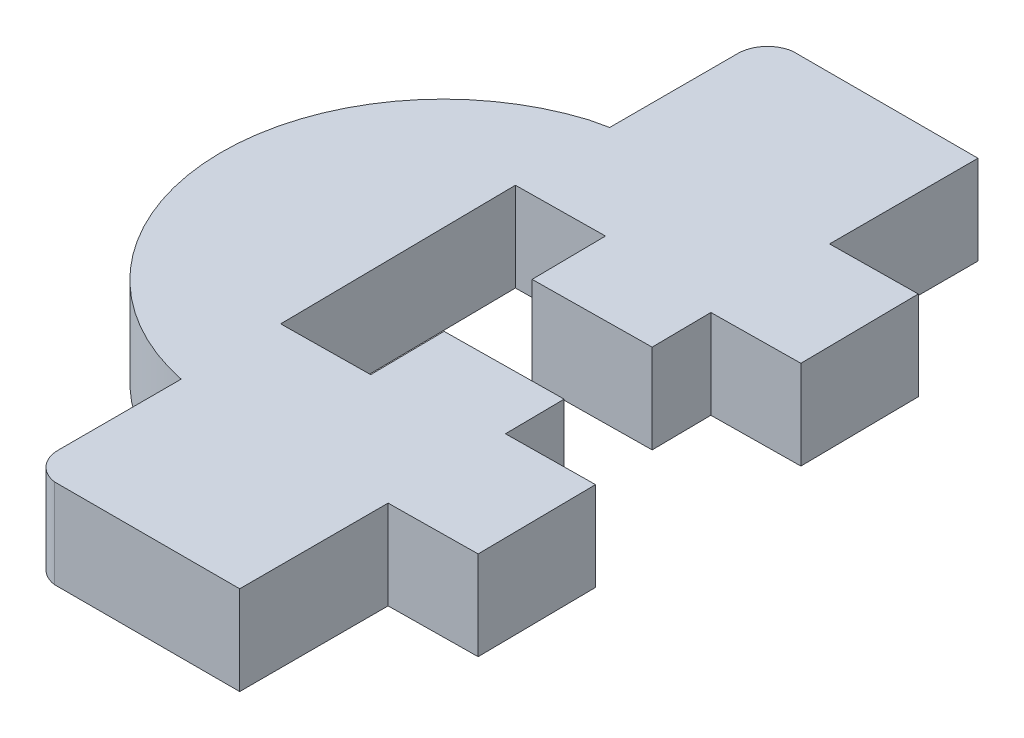
ISO-10303-21;
HEADER;
FILE_DESCRIPTION(('STEP AP214'),'2;1');
FILE_NAME('part.step','',(''),(''),'','','');
FILE_SCHEMA(('AUTOMOTIVE_DESIGN { 1 0 10303 214 1 1 1 1 }'));
ENDSEC;
DATA;
#1=APPLICATION_CONTEXT('core data for automotive mechanical design processes');
#2=APPLICATION_PROTOCOL_DEFINITION('international standard','automotive_design',2000,#1);
#3=PRODUCT_CONTEXT('',#1,'mechanical');
#4=PRODUCT('Part','Part','',(#3));
#5=PRODUCT_RELATED_PRODUCT_CATEGORY('part','',(#4));
#6=PRODUCT_DEFINITION_FORMATION('','',#4);
#7=PRODUCT_DEFINITION_CONTEXT('part definition',#1,'design');
#8=PRODUCT_DEFINITION('design','',#6,#7);
#9=PRODUCT_DEFINITION_SHAPE('','',#8);
#10=(LENGTH_UNIT() NAMED_UNIT(*) SI_UNIT(.MILLI.,.METRE.));
#11=(NAMED_UNIT(*) PLANE_ANGLE_UNIT() SI_UNIT($,.RADIAN.));
#12=(NAMED_UNIT(*) SI_UNIT($,.STERADIAN.) SOLID_ANGLE_UNIT());
#13=UNCERTAINTY_MEASURE_WITH_UNIT(LENGTH_MEASURE(1.E-05),#10,'distance_accuracy_value','');
#14=(GEOMETRIC_REPRESENTATION_CONTEXT(3) GLOBAL_UNCERTAINTY_ASSIGNED_CONTEXT((#13)) GLOBAL_UNIT_ASSIGNED_CONTEXT((#10,
#11,#12)) REPRESENTATION_CONTEXT('',''));
#15=CARTESIAN_POINT('',(0.,0.,0.));
#16=DIRECTION('',(0.,0.,1.));
#17=DIRECTION('',(1.,0.,0.));
#18=AXIS2_PLACEMENT_3D('',#15,#16,#17);
#19=CARTESIAN_POINT('',(33646.1273203237,3.,0.));
#20=DIRECTION('',(1.,0.,0.));
#21=DIRECTION('',(0.,0.,-1.));
#22=AXIS2_PLACEMENT_3D('',#19,#20,#21);
#23=PLANE('',#22);
#24=DIRECTION('',(0.,0.,1.));
#25=VECTOR('',#24,1.);
#26=CARTESIAN_POINT('',(33646.1273203237,0.,0.));
#27=LINE('',#26,#25);
#28=CARTESIAN_POINT('',(33646.1273202987,0.,-12660.1108290611));
#29=VERTEX_POINT('',#28);
#30=CARTESIAN_POINT('',(33646.1273203237,0.,-12655.1108268603));
#31=VERTEX_POINT('',#30);
#32=EDGE_CURVE('E236',#29,#31,#27,.T.);
#33=ORIENTED_EDGE('',*,*,#32,.F.);
#34=DIRECTION('',(0.,-1.,0.));
#35=VECTOR('',#34,1.);
#36=CARTESIAN_POINT('',(33646.1273202987,3.,-12660.1108290611));
#37=LINE('',#36,#35);
#38=CARTESIAN_POINT('',(33646.1273202987,3.,-12660.1108290611));
#39=VERTEX_POINT('',#38);
#40=EDGE_CURVE('E11',#39,#29,#37,.T.);
#41=ORIENTED_EDGE('',*,*,#40,.F.);
#42=DIRECTION('',(0.,0.,1.));
#43=VECTOR('',#42,1.);
#44=CARTESIAN_POINT('',(33646.1273203237,3.,0.));
#45=LINE('',#44,#43);
#46=CARTESIAN_POINT('',(33646.1273203237,3.,-12655.1108268603));
#47=VERTEX_POINT('',#46);
#48=EDGE_CURVE('E299',#39,#47,#45,.T.);
#49=ORIENTED_EDGE('',*,*,#48,.T.);
#50=DIRECTION('',(0.,-1.,0.));
#51=VECTOR('',#50,1.);
#52=CARTESIAN_POINT('',(33646.1273203237,3.,-12655.1108268603));
#53=LINE('',#52,#51);
#54=EDGE_CURVE('E55',#47,#31,#53,.T.);
#55=ORIENTED_EDGE('',*,*,#54,.T.);
#56=EDGE_LOOP('',(#33,#41,#49,#55));
#57=FACE_BOUND('',#56,.T.);
#58=ADVANCED_FACE('F39',(#57),#23,.T.);
#59=CARTESIAN_POINT('',(-139.498977188262,3.,-12276.192079531));
#60=DIRECTION('',(-0.0113626416614809,0.,-0.99993544310344));
#61=DIRECTION('',(-0.99993544310344,0.,0.0113626416614809));
#62=AXIS2_PLACEMENT_3D('',#59,#60,#61);
#63=PLANE('',#62);
#64=DIRECTION('',(0.99993544310344,0.,-0.0113626416614809));
#65=VECTOR('',#64,1.);
#66=CARTESIAN_POINT('',(-139.498977188262,0.,-12276.192079531));
#67=LINE('',#66,#65);
#68=CARTESIAN_POINT('',(33649.1271266281,0.,-12660.1449169861));
#69=VERTEX_POINT('',#68);
#70=EDGE_CURVE('E238',#29,#69,#67,.T.);
#71=ORIENTED_EDGE('',*,*,#70,.T.);
#72=DIRECTION('',(0.,-1.,0.));
#73=VECTOR('',#72,1.);
#74=CARTESIAN_POINT('',(33649.1271266281,3.,-12660.1449169861));
#75=LINE('',#74,#73);
#76=CARTESIAN_POINT('',(33649.1271266281,3.,-12660.1449169861));
#77=VERTEX_POINT('',#76);
#78=EDGE_CURVE('E47',#77,#69,#75,.T.);
#79=ORIENTED_EDGE('',*,*,#78,.F.);
#80=DIRECTION('',(0.99993544310344,0.,-0.0113626416614809));
#81=VECTOR('',#80,1.);
#82=CARTESIAN_POINT('',(-139.498977188262,3.,-12276.192079531));
#83=LINE('',#82,#81);
#84=EDGE_CURVE('E372',#39,#77,#83,.T.);
#85=ORIENTED_EDGE('',*,*,#84,.F.);
#86=ORIENTED_EDGE('',*,*,#40,.T.);
#87=EDGE_LOOP('',(#71,#79,#85,#86));
#88=FACE_BOUND('',#87,.T.);
#89=ADVANCED_FACE('F434',(#88),#63,.F.);
#90=CARTESIAN_POINT('',(33788.6261038149,3.,-383.952837450867));
#91=DIRECTION('',(-0.999935443103441,0.,0.011362641661358));
#92=DIRECTION('',(0.011362641661358,0.,0.999935443103441));
#93=AXIS2_PLACEMENT_3D('',#90,#91,#92);
#94=PLANE('',#93);
#95=DIRECTION('',(-0.011362641661358,0.,-0.999935443103441));
#96=VECTOR('',#95,1.);
#97=CARTESIAN_POINT('',(33788.6261038149,0.,-383.952837450867));
#98=LINE('',#97,#96);
#99=CARTESIAN_POINT('',(33649.0816760614,0.,-12664.1446587585));
#100=VERTEX_POINT('',#99);
#101=EDGE_CURVE('E240',#69,#100,#98,.T.);
#102=ORIENTED_EDGE('',*,*,#101,.T.);
#103=DIRECTION('',(0.,-1.,0.));
#104=VECTOR('',#103,1.);
#105=CARTESIAN_POINT('',(33649.0816760614,3.,-12664.1446587585));
#106=LINE('',#105,#104);
#107=CARTESIAN_POINT('',(33649.0816760614,3.,-12664.1446587585));
#108=VERTEX_POINT('',#107);
#109=EDGE_CURVE('E346',#108,#100,#106,.T.);
#110=ORIENTED_EDGE('',*,*,#109,.F.);
#111=DIRECTION('',(-0.011362641661358,0.,-0.999935443103441));
#112=VECTOR('',#111,1.);
#113=CARTESIAN_POINT('',(33788.6261038149,3.,-383.952837450867));
#114=LINE('',#113,#112);
#115=EDGE_CURVE('E354',#77,#108,#114,.T.);
#116=ORIENTED_EDGE('',*,*,#115,.F.);
#117=ORIENTED_EDGE('',*,*,#78,.T.);
#118=EDGE_LOOP('',(#102,#110,#116,#117));
#119=FACE_BOUND('',#118,.T.);
#120=ADVANCED_FACE('F352',(#119),#94,.F.);
#121=CARTESIAN_POINT('',(-139.544427766973,3.,-12280.191821269));
#122=DIRECTION('',(-0.011362641662495,0.,-0.999935443103428));
#123=DIRECTION('',(-0.999935443103429,0.,0.011362641662495));
#124=AXIS2_PLACEMENT_3D('',#121,#122,#123);
#125=PLANE('',#124);
#126=DIRECTION('',(0.999935443103429,0.,-0.011362641662495));
#127=VECTOR('',#126,1.);
#128=CARTESIAN_POINT('',(-139.544427766973,0.,-12280.191821269));
#129=LINE('',#128,#127);
#130=CARTESIAN_POINT('',(33646.0818697321,0.,-12664.1105708335));
#131=VERTEX_POINT('',#130);
#132=EDGE_CURVE('E243',#131,#100,#129,.T.);
#133=ORIENTED_EDGE('',*,*,#132,.F.);
#134=DIRECTION('',(0.,-1.,0.));
#135=VECTOR('',#134,1.);
#136=CARTESIAN_POINT('',(33646.0818697321,3.,-12664.1105708335));
#137=LINE('',#136,#135);
#138=CARTESIAN_POINT('',(33646.0818697321,3.,-12664.1105708335));
#139=VERTEX_POINT('',#138);
#140=EDGE_CURVE('E344',#139,#131,#137,.T.);
#141=ORIENTED_EDGE('',*,*,#140,.F.);
#142=DIRECTION('',(0.999935443103429,0.,-0.011362641662495));
#143=VECTOR('',#142,1.);
#144=CARTESIAN_POINT('',(-139.544427766973,3.,-12280.191821269));
#145=LINE('',#144,#143);
#146=EDGE_CURVE('E365',#139,#108,#145,.T.);
#147=ORIENTED_EDGE('',*,*,#146,.T.);
#148=ORIENTED_EDGE('',*,*,#109,.T.);
#149=EDGE_LOOP('',(#133,#141,#147,#148));
#150=FACE_BOUND('',#149,.T.);
#151=ADVANCED_FACE('F362',(#150),#125,.T.);
#152=CARTESIAN_POINT('',(33785.6262974424,3.,-383.918749402967));
#153=DIRECTION('',(0.999935443103482,0.,-0.0113626416577351));
#154=DIRECTION('',(-0.0113626416577351,0.,-0.999935443103482));
#155=AXIS2_PLACEMENT_3D('',#152,#153,#154);
#156=PLANE('',#155);
#157=DIRECTION('',(0.0113626416577351,0.,0.999935443103483));
#158=VECTOR('',#157,1.);
#159=CARTESIAN_POINT('',(33785.6262974424,0.,-383.918749402967));
#160=LINE('',#159,#158);
#161=CARTESIAN_POINT('',(33646.0591444488,0.,-12666.1104417197));
#162=VERTEX_POINT('',#161);
#163=EDGE_CURVE('E246',#162,#131,#160,.T.);
#164=ORIENTED_EDGE('',*,*,#163,.F.);
#165=DIRECTION('',(0.,-1.,0.));
#166=VECTOR('',#165,1.);
#167=CARTESIAN_POINT('',(33646.0591444488,3.,-12666.1104417197));
#168=LINE('',#167,#166);
#169=CARTESIAN_POINT('',(33646.0591444488,3.,-12666.1104417197));
#170=VERTEX_POINT('',#169);
#171=EDGE_CURVE('E342',#170,#162,#168,.T.);
#172=ORIENTED_EDGE('',*,*,#171,.F.);
#173=DIRECTION('',(0.0113626416577351,0.,0.999935443103483));
#174=VECTOR('',#173,1.);
#175=CARTESIAN_POINT('',(33785.6262974424,3.,-383.918749402967));
#176=LINE('',#175,#174);
#177=EDGE_CURVE('E368',#170,#139,#176,.T.);
#178=ORIENTED_EDGE('',*,*,#177,.T.);
#179=ORIENTED_EDGE('',*,*,#140,.T.);
#180=EDGE_LOOP('',(#164,#172,#178,#179));
#181=FACE_BOUND('',#180,.T.);
#182=ADVANCED_FACE('F445',(#181),#156,.T.);
#183=CARTESIAN_POINT('',(-139.567153047096,3.,-12282.1916921644));
#184=DIRECTION('',(-0.0113626416622259,0.,-0.999935443103431));
#185=DIRECTION('',(-0.999935443103432,0.,0.0113626416622259));
#186=AXIS2_PLACEMENT_3D('',#183,#184,#185);
#187=PLANE('',#186);
#188=DIRECTION('',(0.999935443103432,0.,-0.0113626416622259));
#189=VECTOR('',#188,1.);
#190=CARTESIAN_POINT('',(-139.567153047096,0.,-12282.1916921644));
#191=LINE('',#190,#189);
#192=CARTESIAN_POINT('',(33642.0594026764,0.,-12666.0649911531));
#193=VERTEX_POINT('',#192);
#194=EDGE_CURVE('E249',#193,#162,#191,.T.);
#195=ORIENTED_EDGE('',*,*,#194,.F.);
#196=DIRECTION('',(0.,-1.,0.));
#197=VECTOR('',#196,1.);
#198=CARTESIAN_POINT('',(33642.0594026764,3.,-12666.0649911531));
#199=LINE('',#198,#197);
#200=CARTESIAN_POINT('',(33642.0594026764,3.,-12666.0649911531));
#201=VERTEX_POINT('',#200);
#202=EDGE_CURVE('E340',#201,#193,#199,.T.);
#203=ORIENTED_EDGE('',*,*,#202,.F.);
#204=DIRECTION('',(0.999935443103432,0.,-0.0113626416622259));
#205=VECTOR('',#204,1.);
#206=CARTESIAN_POINT('',(-139.567153047096,3.,-12282.1916921644));
#207=LINE('',#206,#205);
#208=EDGE_CURVE('E370',#201,#170,#207,.T.);
#209=ORIENTED_EDGE('',*,*,#208,.T.);
#210=ORIENTED_EDGE('',*,*,#171,.T.);
#211=EDGE_LOOP('',(#195,#203,#209,#210));
#212=FACE_BOUND('',#211,.T.);
#213=ADVANCED_FACE('F448',(#212),#187,.T.);
#214=CARTESIAN_POINT('',(33781.6265557715,3.,-383.873299125615));
#215=DIRECTION('',(-0.999935443103386,0.,0.0113626416662626));
#216=DIRECTION('',(0.0113626416662626,0.,0.999935443103386));
#217=AXIS2_PLACEMENT_3D('',#214,#215,#216);
#218=PLANE('',#217);
#219=DIRECTION('',(-0.0113626416662626,0.,-0.999935443103386));
#220=VECTOR('',#219,1.);
#221=CARTESIAN_POINT('',(33781.6265557715,0.,-383.873299125615));
#222=LINE('',#221,#220);
#223=CARTESIAN_POINT('',(33642.0878092805,0.,-12663.5651525453));
#224=VERTEX_POINT('',#223);
#225=EDGE_CURVE('E252',#224,#193,#222,.T.);
#226=ORIENTED_EDGE('',*,*,#225,.F.);
#227=DIRECTION('',(0.,-1.,0.));
#228=VECTOR('',#227,1.);
#229=CARTESIAN_POINT('',(33642.0878092805,3.,-12663.5651525453));
#230=LINE('',#229,#228);
#231=CARTESIAN_POINT('',(33642.0878092805,3.,-12663.5651525453));
#232=VERTEX_POINT('',#231);
#233=EDGE_CURVE('E338',#232,#224,#230,.T.);
#234=ORIENTED_EDGE('',*,*,#233,.F.);
#235=DIRECTION('',(-0.0113626416662626,0.,-0.999935443103386));
#236=VECTOR('',#235,1.);
#237=CARTESIAN_POINT('',(33781.6265557715,3.,-383.873299125615));
#238=LINE('',#237,#236);
#239=EDGE_CURVE('E378',#232,#201,#238,.T.);
#240=ORIENTED_EDGE('',*,*,#239,.T.);
#241=ORIENTED_EDGE('',*,*,#202,.T.);
#242=EDGE_LOOP('',(#226,#234,#240,#241));
#243=FACE_BOUND('',#242,.T.);
#244=ADVANCED_FACE('F452',(#243),#218,.T.);
#245=CARTESIAN_POINT('',(-139.538746375388,3.,-12279.6918537492));
#246=DIRECTION('',(-0.0113626416565477,0.,-0.999935443103496));
#247=DIRECTION('',(-0.999935443103496,0.,0.0113626416565477));
#248=AXIS2_PLACEMENT_3D('',#245,#246,#247);
#249=PLANE('',#248);
#250=DIRECTION('',(0.999935443103496,0.,-0.0113626416565477));
#251=VECTOR('',#250,1.);
#252=CARTESIAN_POINT('',(-139.538746375388,0.,-12279.6918537492));
#253=LINE('',#252,#251);
#254=CARTESIAN_POINT('',(33639.0880029512,0.,-12663.5310646203));
#255=VERTEX_POINT('',#254);
#256=EDGE_CURVE('E255',#255,#224,#253,.T.);
#257=ORIENTED_EDGE('',*,*,#256,.F.);
#258=DIRECTION('',(0.,-1.,0.));
#259=VECTOR('',#258,1.);
#260=CARTESIAN_POINT('',(33639.0880029512,3.,-12663.5310646203));
#261=LINE('',#260,#259);
#262=CARTESIAN_POINT('',(33639.0880029512,3.,-12663.5310646203));
#263=VERTEX_POINT('',#262);
#264=EDGE_CURVE('E336',#263,#255,#261,.T.);
#265=ORIENTED_EDGE('',*,*,#264,.F.);
#266=DIRECTION('',(0.999935443103496,0.,-0.0113626416565477));
#267=VECTOR('',#266,1.);
#268=CARTESIAN_POINT('',(-139.538746375388,3.,-12279.6918537492));
#269=LINE('',#268,#267);
#270=EDGE_CURVE('E381',#263,#232,#269,.T.);
#271=ORIENTED_EDGE('',*,*,#270,.T.);
#272=ORIENTED_EDGE('',*,*,#233,.T.);
#273=EDGE_LOOP('',(#257,#265,#271,#272));
#274=FACE_BOUND('',#273,.T.);
#275=ADVANCED_FACE('F456',(#274),#249,.T.);
#276=CARTESIAN_POINT('',(33778.6267493417,3.,-383.83921091417));
#277=DIRECTION('',(0.999935443103481,0.,-0.0113626416578179));
#278=DIRECTION('',(-0.0113626416578179,0.,-0.999935443103482));
#279=AXIS2_PLACEMENT_3D('',#276,#277,#278);
#280=PLANE('',#279);
#281=DIRECTION('',(0.0113626416578179,0.,0.999935443103482));
#282=VECTOR('',#281,1.);
#283=CARTESIAN_POINT('',(33778.6267493417,0.,-383.83921091417));
#284=LINE('',#283,#282);
#285=CARTESIAN_POINT('',(33638.9971018179,0.,-12671.5305481651));
#286=VERTEX_POINT('',#285);
#287=EDGE_CURVE('E258',#286,#255,#284,.T.);
#288=ORIENTED_EDGE('',*,*,#287,.F.);
#289=DIRECTION('',(0.,-1.,0.));
#290=VECTOR('',#289,1.);
#291=CARTESIAN_POINT('',(33638.9971018179,3.,-12671.5305481651));
#292=LINE('',#291,#290);
#293=CARTESIAN_POINT('',(33638.9971018179,3.,-12671.5305481651));
#294=VERTEX_POINT('',#293);
#295=EDGE_CURVE('E334',#294,#286,#292,.T.);
#296=ORIENTED_EDGE('',*,*,#295,.F.);
#297=DIRECTION('',(0.0113626416578179,0.,0.999935443103482));
#298=VECTOR('',#297,1.);
#299=CARTESIAN_POINT('',(33778.6267493417,3.,-383.83921091417));
#300=LINE('',#299,#298);
#301=EDGE_CURVE('E384',#294,#263,#300,.T.);
#302=ORIENTED_EDGE('',*,*,#301,.T.);
#303=ORIENTED_EDGE('',*,*,#264,.T.);
#304=EDGE_LOOP('',(#288,#296,#302,#303));
#305=FACE_BOUND('',#304,.T.);
#306=ADVANCED_FACE('F460',(#305),#280,.T.);
#307=CARTESIAN_POINT('',(-139.629647579762,3.,-12287.6913370914));
#308=DIRECTION('',(0.0113626416625219,0.,0.999935443103428));
#309=DIRECTION('',(0.999935443103428,0.,-0.0113626416625219));
#310=AXIS2_PLACEMENT_3D('',#307,#308,#309);
#311=PLANE('',#310);
#312=DIRECTION('',(-0.999935443103428,0.,0.0113626416625219));
#313=VECTOR('',#312,1.);
#314=CARTESIAN_POINT('',(-139.629647579762,0.,-12287.6913370914));
#315=LINE('',#314,#313);
#316=CARTESIAN_POINT('',(33641.9969081472,0.,-12671.5646360901));
#317=VERTEX_POINT('',#316);
#318=EDGE_CURVE('E261',#317,#286,#315,.T.);
#319=ORIENTED_EDGE('',*,*,#318,.F.);
#320=DIRECTION('',(0.,-1.,0.));
#321=VECTOR('',#320,1.);
#322=CARTESIAN_POINT('',(33641.9969081472,3.,-12671.5646360901));
#323=LINE('',#322,#321);
#324=CARTESIAN_POINT('',(33641.9969081472,3.,-12671.5646360901));
#325=VERTEX_POINT('',#324);
#326=EDGE_CURVE('E332',#325,#317,#323,.T.);
#327=ORIENTED_EDGE('',*,*,#326,.F.);
#328=DIRECTION('',(-0.999935443103428,0.,0.0113626416625219));
#329=VECTOR('',#328,1.);
#330=CARTESIAN_POINT('',(-139.629647579762,3.,-12287.6913370914));
#331=LINE('',#330,#329);
#332=EDGE_CURVE('E387',#325,#294,#331,.T.);
#333=ORIENTED_EDGE('',*,*,#332,.T.);
#334=ORIENTED_EDGE('',*,*,#295,.T.);
#335=EDGE_LOOP('',(#319,#327,#333,#334));
#336=FACE_BOUND('',#335,.T.);
#337=ADVANCED_FACE('F464',(#336),#311,.T.);
#338=CARTESIAN_POINT('',(33781.626555637,3.,-383.873298742192));
#339=DIRECTION('',(-0.999935443103514,0.,0.0113626416549599));
#340=DIRECTION('',(0.0113626416549599,0.,0.999935443103514));
#341=AXIS2_PLACEMENT_3D('',#338,#339,#340);
#342=PLANE('',#341);
#343=DIRECTION('',(-0.0113626416549599,0.,-0.999935443103514));
#344=VECTOR('',#343,1.);
#345=CARTESIAN_POINT('',(33781.626555637,0.,-383.873298742192));
#346=LINE('',#345,#344);
#347=CARTESIAN_POINT('',(33642.0253147514,0.,-12669.0647974824));
#348=VERTEX_POINT('',#347);
#349=EDGE_CURVE('E264',#348,#317,#346,.T.);
#350=ORIENTED_EDGE('',*,*,#349,.F.);
#351=DIRECTION('',(0.,-1.,0.));
#352=VECTOR('',#351,1.);
#353=CARTESIAN_POINT('',(33642.0253147514,3.,-12669.0647974824));
#354=LINE('',#353,#352);
#355=CARTESIAN_POINT('',(33642.0253147514,3.,-12669.0647974824));
#356=VERTEX_POINT('',#355);
#357=EDGE_CURVE('E330',#356,#348,#354,.T.);
#358=ORIENTED_EDGE('',*,*,#357,.F.);
#359=DIRECTION('',(-0.0113626416549599,0.,-0.999935443103514));
#360=VECTOR('',#359,1.);
#361=CARTESIAN_POINT('',(33781.626555637,3.,-383.873298742192));
#362=LINE('',#361,#360);
#363=EDGE_CURVE('E390',#356,#325,#362,.T.);
#364=ORIENTED_EDGE('',*,*,#363,.T.);
#365=ORIENTED_EDGE('',*,*,#326,.T.);
#366=EDGE_LOOP('',(#350,#358,#364,#365));
#367=FACE_BOUND('',#366,.T.);
#368=ADVANCED_FACE('F468',(#367),#342,.T.);
#369=CARTESIAN_POINT('',(-139.601240939892,3.,-12285.1914985854));
#370=DIRECTION('',(0.0113626416595213,0.,0.999935443103462));
#371=DIRECTION('',(0.999935443103462,0.,-0.0113626416595214));
#372=AXIS2_PLACEMENT_3D('',#369,#370,#371);
#373=PLANE('',#372);
#374=DIRECTION('',(-0.999935443103462,0.,0.0113626416595214));
#375=VECTOR('',#374,1.);
#376=CARTESIAN_POINT('',(-139.601240939892,0.,-12285.1914985854));
#377=LINE('',#376,#375);
#378=CARTESIAN_POINT('',(33646.0250565238,0.,-12669.110248049));
#379=VERTEX_POINT('',#378);
#380=EDGE_CURVE('E267',#379,#348,#377,.T.);
#381=ORIENTED_EDGE('',*,*,#380,.F.);
#382=DIRECTION('',(0.,-1.,0.));
#383=VECTOR('',#382,1.);
#384=CARTESIAN_POINT('',(33646.0250565238,3.,-12669.110248049));
#385=LINE('',#384,#383);
#386=CARTESIAN_POINT('',(33646.0250565238,3.,-12669.110248049));
#387=VERTEX_POINT('',#386);
#388=EDGE_CURVE('E328',#387,#379,#385,.T.);
#389=ORIENTED_EDGE('',*,*,#388,.F.);
#390=DIRECTION('',(-0.999935443103462,0.,0.0113626416595214));
#391=VECTOR('',#390,1.);
#392=CARTESIAN_POINT('',(-139.601240939892,3.,-12285.1914985854));
#393=LINE('',#392,#391);
#394=EDGE_CURVE('E393',#387,#356,#393,.T.);
#395=ORIENTED_EDGE('',*,*,#394,.T.);
#396=ORIENTED_EDGE('',*,*,#357,.T.);
#397=EDGE_LOOP('',(#381,#389,#395,#396));
#398=FACE_BOUND('',#397,.T.);
#399=ADVANCED_FACE('F472',(#398),#373,.T.);
#400=CARTESIAN_POINT('',(33785.6262975697,3.,-383.918749765893));
#401=DIRECTION('',(0.999935443103361,0.,-0.0113626416684323));
#402=DIRECTION('',(-0.0113626416684323,0.,-0.999935443103361));
#403=AXIS2_PLACEMENT_3D('',#400,#401,#402);
#404=PLANE('',#403);
#405=DIRECTION('',(0.0113626416684323,0.,0.999935443103361));
#406=VECTOR('',#405,1.);
#407=CARTESIAN_POINT('',(33785.6262975697,0.,-383.918749765893));
#408=LINE('',#407,#406);
#409=CARTESIAN_POINT('',(33646.0023312405,0.,-12671.1101189352));
#410=VERTEX_POINT('',#409);
#411=EDGE_CURVE('E270',#410,#379,#408,.T.);
#412=ORIENTED_EDGE('',*,*,#411,.F.);
#413=DIRECTION('',(0.,-1.,0.));
#414=VECTOR('',#413,1.);
#415=CARTESIAN_POINT('',(33646.0023312405,3.,-12671.1101189352));
#416=LINE('',#415,#414);
#417=CARTESIAN_POINT('',(33646.0023312405,3.,-12671.1101189352));
#418=VERTEX_POINT('',#417);
#419=EDGE_CURVE('E326',#418,#410,#416,.T.);
#420=ORIENTED_EDGE('',*,*,#419,.F.);
#421=DIRECTION('',(0.0113626416684323,0.,0.999935443103361));
#422=VECTOR('',#421,1.);
#423=CARTESIAN_POINT('',(33785.6262975697,3.,-383.918749765893));
#424=LINE('',#423,#422);
#425=EDGE_CURVE('E396',#418,#387,#424,.T.);
#426=ORIENTED_EDGE('',*,*,#425,.T.);
#427=ORIENTED_EDGE('',*,*,#388,.T.);
#428=EDGE_LOOP('',(#412,#420,#426,#427));
#429=FACE_BOUND('',#428,.T.);
#430=ADVANCED_FACE('F476',(#429),#404,.T.);
#431=CARTESIAN_POINT('',(-139.623966230099,3.,-12287.191369452));
#432=DIRECTION('',(0.0113626416600999,0.,0.999935443103455));
#433=DIRECTION('',(0.999935443103456,0.,-0.0113626416600999));
#434=AXIS2_PLACEMENT_3D('',#431,#432,#433);
#435=PLANE('',#434);
#436=DIRECTION('',(-0.999935443103456,0.,0.0113626416600999));
#437=VECTOR('',#436,1.);
#438=CARTESIAN_POINT('',(-139.623966230099,0.,-12287.191369452));
#439=LINE('',#438,#437);
#440=CARTESIAN_POINT('',(33649.0021375698,0.,-12671.1442068602));
#441=VERTEX_POINT('',#440);
#442=EDGE_CURVE('E273',#441,#410,#439,.T.);
#443=ORIENTED_EDGE('',*,*,#442,.F.);
#444=DIRECTION('',(0.,-1.,0.));
#445=VECTOR('',#444,1.);
#446=CARTESIAN_POINT('',(33649.0021375698,3.,-12671.1442068602));
#447=LINE('',#446,#445);
#448=CARTESIAN_POINT('',(33649.0021375698,3.,-12671.1442068602));
#449=VERTEX_POINT('',#448);
#450=EDGE_CURVE('E324',#449,#441,#447,.T.);
#451=ORIENTED_EDGE('',*,*,#450,.F.);
#452=DIRECTION('',(-0.999935443103456,0.,0.0113626416600999));
#453=VECTOR('',#452,1.);
#454=CARTESIAN_POINT('',(-139.623966230099,3.,-12287.191369452));
#455=LINE('',#454,#453);
#456=EDGE_CURVE('E399',#449,#418,#455,.T.);
#457=ORIENTED_EDGE('',*,*,#456,.T.);
#458=ORIENTED_EDGE('',*,*,#419,.T.);
#459=EDGE_LOOP('',(#443,#451,#457,#458));
#460=FACE_BOUND('',#459,.T.);
#461=ADVANCED_FACE('F480',(#460),#435,.T.);
#462=CARTESIAN_POINT('',(33788.6261038569,3.,-383.952837570712));
#463=DIRECTION('',(-0.999935443103401,0.,0.0113626416648901));
#464=DIRECTION('',(0.0113626416648901,0.,0.999935443103401));
#465=AXIS2_PLACEMENT_3D('',#462,#463,#464);
#466=PLANE('',#465);
#467=DIRECTION('',(-0.0113626416648901,0.,-0.999935443103401));
#468=VECTOR('',#467,1.);
#469=CARTESIAN_POINT('',(33788.6261038569,0.,-383.952837570712));
#470=LINE('',#469,#468);
#471=CARTESIAN_POINT('',(33648.9566870031,0.,-12675.1439486326));
#472=VERTEX_POINT('',#471);
#473=EDGE_CURVE('E276',#441,#472,#470,.T.);
#474=ORIENTED_EDGE('',*,*,#473,.T.);
#475=DIRECTION('',(0.,-1.,0.));
#476=VECTOR('',#475,1.);
#477=CARTESIAN_POINT('',(33648.9566870031,3.,-12675.1439486326));
#478=LINE('',#477,#476);
#479=CARTESIAN_POINT('',(33648.9566870031,3.,-12675.1439486326));
#480=VERTEX_POINT('',#479);
#481=EDGE_CURVE('E321',#480,#472,#478,.T.);
#482=ORIENTED_EDGE('',*,*,#481,.F.);
#483=DIRECTION('',(-0.0113626416648901,0.,-0.999935443103401));
#484=VECTOR('',#483,1.);
#485=CARTESIAN_POINT('',(33788.6261038569,3.,-383.952837570712));
#486=LINE('',#485,#484);
#487=EDGE_CURVE('E402',#449,#480,#486,.T.);
#488=ORIENTED_EDGE('',*,*,#487,.F.);
#489=ORIENTED_EDGE('',*,*,#450,.T.);
#490=EDGE_LOOP('',(#474,#482,#488,#489));
#491=FACE_BOUND('',#490,.T.);
#492=ADVANCED_FACE('F484',(#491),#466,.F.);
#493=CARTESIAN_POINT('',(-139.669416843521,3.,-12291.1911110911));
#494=DIRECTION('',(0.0113626416640285,0.,0.999935443103411));
#495=DIRECTION('',(0.999935443103411,0.,-0.0113626416640285));
#496=AXIS2_PLACEMENT_3D('',#493,#494,#495);
#497=PLANE('',#496);
#498=DIRECTION('',(-0.999935443103411,0.,0.0113626416640285));
#499=VECTOR('',#498,1.);
#500=CARTESIAN_POINT('',(-139.669416843521,0.,-12291.1911110911));
#501=LINE('',#500,#499);
#502=CARTESIAN_POINT('',(33646.0023312405,0.,-12675.1103771795));
#503=VERTEX_POINT('',#502);
#504=EDGE_CURVE('E278',#472,#503,#501,.T.);
#505=ORIENTED_EDGE('',*,*,#504,.T.);
#506=DIRECTION('',(0.,-1.,0.));
#507=VECTOR('',#506,1.);
#508=CARTESIAN_POINT('',(33646.0023312405,3.,-12675.1103771795));
#509=LINE('',#508,#507);
#510=CARTESIAN_POINT('',(33646.0023312405,3.,-12675.1103771795));
#511=VERTEX_POINT('',#510);
#512=EDGE_CURVE('E318',#511,#503,#509,.T.);
#513=ORIENTED_EDGE('',*,*,#512,.F.);
#514=DIRECTION('',(-0.999935443103411,0.,0.0113626416640285));
#515=VECTOR('',#514,1.);
#516=CARTESIAN_POINT('',(-139.669416843521,3.,-12291.1911110911));
#517=LINE('',#516,#515);
#518=EDGE_CURVE('E404',#480,#511,#517,.T.);
#519=ORIENTED_EDGE('',*,*,#518,.F.);
#520=ORIENTED_EDGE('',*,*,#481,.T.);
#521=EDGE_LOOP('',(#505,#513,#519,#520));
#522=FACE_BOUND('',#521,.T.);
#523=ADVANCED_FACE('F488',(#522),#497,.F.);
#524=CARTESIAN_POINT('',(33646.0023312405,3.,0.));
#525=DIRECTION('',(-1.,0.,0.));
#526=DIRECTION('',(0.,0.,1.));
#527=AXIS2_PLACEMENT_3D('',#524,#525,#526);
#528=PLANE('',#527);
#529=DIRECTION('',(0.,0.,-1.));
#530=VECTOR('',#529,1.);
#531=CARTESIAN_POINT('',(33646.0023312405,0.,0.));
#532=LINE('',#531,#530);
#533=CARTESIAN_POINT('',(33646.0023312405,0.,-12680.1103771795));
#534=VERTEX_POINT('',#533);
#535=EDGE_CURVE('E280',#503,#534,#532,.T.);
#536=ORIENTED_EDGE('',*,*,#535,.T.);
#537=DIRECTION('',(0.,-1.,0.));
#538=VECTOR('',#537,1.);
#539=CARTESIAN_POINT('',(33646.0023312405,3.,-12680.1103771795));
#540=LINE('',#539,#538);
#541=CARTESIAN_POINT('',(33646.0023312405,3.,-12680.1103771795));
#542=VERTEX_POINT('',#541);
#543=EDGE_CURVE('E315',#542,#534,#540,.T.);
#544=ORIENTED_EDGE('',*,*,#543,.F.);
#545=DIRECTION('',(0.,0.,-1.));
#546=VECTOR('',#545,1.);
#547=CARTESIAN_POINT('',(33646.0023312405,3.,0.));
#548=LINE('',#547,#546);
#549=EDGE_CURVE('E406',#511,#542,#548,.T.);
#550=ORIENTED_EDGE('',*,*,#549,.F.);
#551=ORIENTED_EDGE('',*,*,#512,.T.);
#552=EDGE_LOOP('',(#536,#544,#550,#551));
#553=FACE_BOUND('',#552,.T.);
#554=ADVANCED_FACE('F492',(#553),#528,.F.);
#555=CARTESIAN_POINT('',(0.,3.,-12680.1103771795));
#556=DIRECTION('',(0.,0.,1.));
#557=DIRECTION('',(1.,0.,0.));
#558=AXIS2_PLACEMENT_3D('',#555,#556,#557);
#559=PLANE('',#558);
#560=DIRECTION('',(-1.,0.,0.));
#561=VECTOR('',#560,1.);
#562=CARTESIAN_POINT('',(0.,0.,-12680.1103771795));
#563=LINE('',#562,#561);
#564=CARTESIAN_POINT('',(33639.7589633635,0.,-12680.1103771795));
#565=VERTEX_POINT('',#564);
#566=EDGE_CURVE('E282',#534,#565,#563,.T.);
#567=ORIENTED_EDGE('',*,*,#566,.T.);
#568=DIRECTION('',(0.,-1.,0.));
#569=VECTOR('',#568,1.);
#570=CARTESIAN_POINT('',(33639.7589633635,3.,-12680.1103771795));
#571=LINE('',#570,#569);
#572=CARTESIAN_POINT('',(33639.7589633635,3.,-12680.1103771795));
#573=VERTEX_POINT('',#572);
#574=EDGE_CURVE('E312',#573,#565,#571,.T.);
#575=ORIENTED_EDGE('',*,*,#574,.F.);
#576=DIRECTION('',(-1.,0.,0.));
#577=VECTOR('',#576,1.);
#578=CARTESIAN_POINT('',(0.,3.,-12680.1103771795));
#579=LINE('',#578,#577);
#580=EDGE_CURVE('E408',#542,#573,#579,.T.);
#581=ORIENTED_EDGE('',*,*,#580,.F.);
#582=ORIENTED_EDGE('',*,*,#543,.T.);
#583=EDGE_LOOP('',(#567,#575,#581,#582));
#584=FACE_BOUND('',#583,.T.);
#585=ADVANCED_FACE('F496',(#584),#559,.F.);
#586=CARTESIAN_POINT('',(33639.8981819288,3.,-12679.1215535986));
#587=DIRECTION('',(0.,-1.,0.));
#588=DIRECTION('',(0.,0.,-1.));
#589=AXIS2_PLACEMENT_3D('',#586,#587,#588);
#590=CYLINDRICAL_SURFACE('',#589,0.998575927547597);
#591=CARTESIAN_POINT('',(33639.8981819288,0.,-12679.1215535986));
#592=DIRECTION('',(0.,1.,0.));
#593=DIRECTION('',(0.,0.,1.));
#594=AXIS2_PLACEMENT_3D('',#591,#592,#593);
#595=CIRCLE('',#594,0.998575927547597);
#596=CARTESIAN_POINT('',(33638.8996060013,0.,-12679.1215535986));
#597=VERTEX_POINT('',#596);
#598=EDGE_CURVE('E284',#565,#597,#595,.T.);
#599=ORIENTED_EDGE('',*,*,#598,.T.);
#600=DIRECTION('',(0.,-1.,0.));
#601=VECTOR('',#600,1.);
#602=CARTESIAN_POINT('',(33638.8996060013,3.,-12679.1215535986));
#603=LINE('',#602,#601);
#604=CARTESIAN_POINT('',(33638.8996060013,3.,-12679.1215535986));
#605=VERTEX_POINT('',#604);
#606=EDGE_CURVE('E309',#605,#597,#603,.T.);
#607=ORIENTED_EDGE('',*,*,#606,.F.);
#608=CARTESIAN_POINT('',(33639.8981819288,3.,-12679.1215535986));
#609=DIRECTION('',(0.,1.,0.));
#610=DIRECTION('',(0.,0.,1.));
#611=AXIS2_PLACEMENT_3D('',#608,#609,#610);
#612=CIRCLE('',#611,0.998575927547597);
#613=EDGE_CURVE('E410',#573,#605,#612,.T.);
#614=ORIENTED_EDGE('',*,*,#613,.F.);
#615=ORIENTED_EDGE('',*,*,#574,.T.);
#616=EDGE_LOOP('',(#599,#607,#614,#615));
#617=FACE_BOUND('',#616,.T.);
#618=ADVANCED_FACE('F500',(#617),#590,.T.);
#619=CARTESIAN_POINT('',(33638.8996060013,3.,0.));
#620=DIRECTION('',(1.,0.,0.));
#621=DIRECTION('',(0.,0.,-1.));
#622=AXIS2_PLACEMENT_3D('',#619,#620,#621);
#623=PLANE('',#622);
#624=DIRECTION('',(0.,0.,1.));
#625=VECTOR('',#624,1.);
#626=CARTESIAN_POINT('',(33638.8996060013,0.,0.));
#627=LINE('',#626,#625);
#628=CARTESIAN_POINT('',(33638.8996060013,0.,-12674.8022561867));
#629=VERTEX_POINT('',#628);
#630=EDGE_CURVE('E286',#597,#629,#627,.T.);
#631=ORIENTED_EDGE('',*,*,#630,.T.);
#632=DIRECTION('',(0.,-1.,0.));
#633=VECTOR('',#632,1.);
#634=CARTESIAN_POINT('',(33638.8996060013,3.,-12674.8022561867));
#635=LINE('',#634,#633);
#636=CARTESIAN_POINT('',(33638.8996060013,3.,-12674.8022561867));
#637=VERTEX_POINT('',#636);
#638=EDGE_CURVE('E306',#637,#629,#635,.T.);
#639=ORIENTED_EDGE('',*,*,#638,.F.);
#640=DIRECTION('',(0.,0.,1.));
#641=VECTOR('',#640,1.);
#642=CARTESIAN_POINT('',(33638.8996060013,3.,0.));
#643=LINE('',#642,#641);
#644=EDGE_CURVE('E412',#605,#637,#643,.T.);
#645=ORIENTED_EDGE('',*,*,#644,.F.);
#646=ORIENTED_EDGE('',*,*,#606,.T.);
#647=EDGE_LOOP('',(#631,#639,#645,#646));
#648=FACE_BOUND('',#647,.T.);
#649=ADVANCED_FACE('F504',(#648),#623,.F.);
#650=CARTESIAN_POINT('',(-1089.57422288692,3.,-4813.12976964064));
#651=DIRECTION('',(0.220788834450103,0.,0.975321634427415));
#652=DIRECTION('',(0.975321634427416,0.,-0.220788834450103));
#653=AXIS2_PLACEMENT_3D('',#650,#651,#652);
#654=PLANE('',#653);
#655=DIRECTION('',(-0.975321634427415,0.,0.220788834450103));
#656=VECTOR('',#655,1.);
#657=CARTESIAN_POINT('',(-1089.57422288692,0.,-4813.12976964064));
#658=LINE('',#657,#656);
#659=CARTESIAN_POINT('',(33638.3132168301,0.,-12674.6695120979));
#660=VERTEX_POINT('',#659);
#661=EDGE_CURVE('E288',#629,#660,#658,.T.);
#662=ORIENTED_EDGE('',*,*,#661,.T.);
#663=DIRECTION('',(0.,-1.,0.));
#664=VECTOR('',#663,1.);
#665=CARTESIAN_POINT('',(33638.3132168301,3.,-12674.6695120979));
#666=LINE('',#665,#664);
#667=CARTESIAN_POINT('',(33638.3132168301,3.,-12674.6695120979));
#668=VERTEX_POINT('',#667);
#669=EDGE_CURVE('E303',#668,#660,#666,.T.);
#670=ORIENTED_EDGE('',*,*,#669,.F.);
#671=DIRECTION('',(-0.975321634427415,0.,0.220788834450103));
#672=VECTOR('',#671,1.);
#673=CARTESIAN_POINT('',(-1089.57422288692,3.,-4813.12976964064));
#674=LINE('',#673,#672);
#675=EDGE_CURVE('E231',#637,#668,#674,.T.);
#676=ORIENTED_EDGE('',*,*,#675,.F.);
#677=ORIENTED_EDGE('',*,*,#638,.T.);
#678=EDGE_LOOP('',(#662,#670,#676,#677));
#679=FACE_BOUND('',#678,.T.);
#680=ADVANCED_FACE('F418',(#679),#654,.F.);
#681=CARTESIAN_POINT('',(33640.5424555499,3.,-12667.5478503551));
#682=DIRECTION('',(0.,-1.,0.));
#683=DIRECTION('',(0.,0.,-1.));
#684=AXIS2_PLACEMENT_3D('',#681,#682,#683);
#685=CYLINDRICAL_SURFACE('',#684,7.46241055212603);
#686=CARTESIAN_POINT('',(33640.5424555499,0.,-12667.5478503551));
#687=DIRECTION('',(0.,1.,0.));
#688=DIRECTION('',(0.,0.,1.));
#689=AXIS2_PLACEMENT_3D('',#686,#687,#688);
#690=CIRCLE('',#689,7.46241055212603);
#691=CARTESIAN_POINT('',(33639.0245950845,0.,-12660.2414373599));
#692=VERTEX_POINT('',#691);
#693=EDGE_CURVE('E290',#660,#692,#690,.T.);
#694=ORIENTED_EDGE('',*,*,#693,.T.);
#695=DIRECTION('',(0.,-1.,0.));
#696=VECTOR('',#695,1.);
#697=CARTESIAN_POINT('',(33639.0245950845,3.,-12660.2414373599));
#698=LINE('',#697,#696);
#699=CARTESIAN_POINT('',(33639.0245950845,3.,-12660.2414373599));
#700=VERTEX_POINT('',#699);
#701=EDGE_CURVE('E217',#700,#692,#698,.T.);
#702=ORIENTED_EDGE('',*,*,#701,.F.);
#703=CARTESIAN_POINT('',(33640.5424555499,3.,-12667.5478503551));
#704=DIRECTION('',(0.,1.,0.));
#705=DIRECTION('',(0.,0.,1.));
#706=AXIS2_PLACEMENT_3D('',#703,#704,#705);
#707=CIRCLE('',#706,7.46241055212603);
#708=EDGE_CURVE('E228',#668,#700,#707,.T.);
#709=ORIENTED_EDGE('',*,*,#708,.F.);
#710=ORIENTED_EDGE('',*,*,#669,.T.);
#711=EDGE_LOOP('',(#694,#702,#709,#710));
#712=FACE_BOUND('',#711,.T.);
#713=ADVANCED_FACE('F422',(#712),#685,.T.);
#714=CARTESIAN_POINT('',(33639.0245950628,3.,5.77093052670239E-08));
#715=DIRECTION('',(-1.,0.,-1.71554633232421E-12));
#716=DIRECTION('',(-1.71554633232421E-12,0.,1.));
#717=AXIS2_PLACEMENT_3D('',#714,#715,#716);
#718=PLANE('',#717);
#719=DIRECTION('',(1.71554633232421E-12,0.,-1.));
#720=VECTOR('',#719,1.);
#721=CARTESIAN_POINT('',(33639.0245950628,0.,5.77093052670239E-08));
#722=LINE('',#721,#720);
#723=CARTESIAN_POINT('',(33639.0245950845,0.,-12656.0996504412));
#724=VERTEX_POINT('',#723);
#725=EDGE_CURVE('E214',#724,#692,#722,.T.);
#726=ORIENTED_EDGE('',*,*,#725,.F.);
#727=DIRECTION('',(0.,-1.,0.));
#728=VECTOR('',#727,1.);
#729=CARTESIAN_POINT('',(33639.0245950845,3.,-12656.0996504412));
#730=LINE('',#729,#728);
#731=CARTESIAN_POINT('',(33639.0245950845,3.,-12656.0996504412));
#732=VERTEX_POINT('',#731);
#733=EDGE_CURVE('E208',#732,#724,#730,.T.);
#734=ORIENTED_EDGE('',*,*,#733,.F.);
#735=DIRECTION('',(1.71554633232421E-12,0.,-1.));
#736=VECTOR('',#735,1.);
#737=CARTESIAN_POINT('',(33639.0245950628,3.,5.77093052670239E-08));
#738=LINE('',#737,#736);
#739=EDGE_CURVE('E212',#732,#700,#738,.T.);
#740=ORIENTED_EDGE('',*,*,#739,.T.);
#741=ORIENTED_EDGE('',*,*,#701,.T.);
#742=EDGE_LOOP('',(#726,#734,#740,#741));
#743=FACE_BOUND('',#742,.T.);
#744=ADVANCED_FACE('F210',(#743),#718,.T.);
#745=CARTESIAN_POINT('',(33640.0231710121,3.,-12656.0996504412));
#746=DIRECTION('',(0.,-1.,0.));
#747=DIRECTION('',(0.,0.,-1.));
#748=AXIS2_PLACEMENT_3D('',#745,#746,#747);
#749=CYLINDRICAL_SURFACE('',#748,0.998575927541644);
#750=CARTESIAN_POINT('',(33640.0231710121,0.,-12656.0996504412));
#751=DIRECTION('',(0.,1.,0.));
#752=DIRECTION('',(0.,0.,1.));
#753=AXIS2_PLACEMENT_3D('',#750,#751,#752);
#754=CIRCLE('',#753,0.998575927541644);
#755=CARTESIAN_POINT('',(33639.8839524467,0.,-12655.1108268603));
#756=VERTEX_POINT('',#755);
#757=EDGE_CURVE('E294',#724,#756,#754,.T.);
#758=ORIENTED_EDGE('',*,*,#757,.T.);
#759=DIRECTION('',(0.,-1.,0.));
#760=VECTOR('',#759,1.);
#761=CARTESIAN_POINT('',(33639.8839524467,3.,-12655.1108268603));
#762=LINE('',#761,#760);
#763=CARTESIAN_POINT('',(33639.8839524467,3.,-12655.1108268603));
#764=VERTEX_POINT('',#763);
#765=EDGE_CURVE('E132',#764,#756,#762,.T.);
#766=ORIENTED_EDGE('',*,*,#765,.F.);
#767=CARTESIAN_POINT('',(33640.0231710121,3.,-12656.0996504412));
#768=DIRECTION('',(0.,1.,0.));
#769=DIRECTION('',(0.,0.,1.));
#770=AXIS2_PLACEMENT_3D('',#767,#768,#769);
#771=CIRCLE('',#770,0.998575927541644);
#772=EDGE_CURVE('E219',#732,#764,#771,.T.);
#773=ORIENTED_EDGE('',*,*,#772,.F.);
#774=ORIENTED_EDGE('',*,*,#733,.T.);
#775=EDGE_LOOP('',(#758,#766,#773,#774));
#776=FACE_BOUND('',#775,.T.);
#777=ADVANCED_FACE('F220',(#776),#749,.T.);
#778=CARTESIAN_POINT('',(1.80030979382093E-08,3.,-12655.1108269082));
#779=DIRECTION('',(-1.42259504357163E-12,0.,1.));
#780=DIRECTION('',(1.,0.,1.42259504357163E-12));
#781=AXIS2_PLACEMENT_3D('',#778,#779,#780);
#782=PLANE('',#781);
#783=DIRECTION('',(-1.,0.,-1.42259504357163E-12));
#784=VECTOR('',#783,1.);
#785=CARTESIAN_POINT('',(1.80030979382093E-08,0.,-12655.1108269082));
#786=LINE('',#785,#784);
#787=EDGE_CURVE('E296',#31,#756,#786,.T.);
#788=ORIENTED_EDGE('',*,*,#787,.F.);
#789=ORIENTED_EDGE('',*,*,#54,.F.);
#790=DIRECTION('',(-1.,0.,-1.42259504357163E-12));
#791=VECTOR('',#790,1.);
#792=CARTESIAN_POINT('',(1.80030979382093E-08,3.,-12655.1108269082));
#793=LINE('',#792,#791);
#794=EDGE_CURVE('E223',#47,#764,#793,.T.);
#795=ORIENTED_EDGE('',*,*,#794,.T.);
#796=ORIENTED_EDGE('',*,*,#765,.T.);
#797=EDGE_LOOP('',(#788,#789,#795,#796));
#798=FACE_BOUND('',#797,.T.);
#799=ADVANCED_FACE('F423',(#798),#782,.T.);
#800=CARTESIAN_POINT('',(0.,3.,0.));
#801=DIRECTION('',(0.,1.,0.));
#802=DIRECTION('',(0.,0.,1.));
#803=AXIS2_PLACEMENT_3D('',#800,#801,#802);
#804=PLANE('',#803);
#805=ORIENTED_EDGE('',*,*,#48,.F.);
#806=ORIENTED_EDGE('',*,*,#84,.T.);
#807=ORIENTED_EDGE('',*,*,#115,.T.);
#808=ORIENTED_EDGE('',*,*,#146,.F.);
#809=ORIENTED_EDGE('',*,*,#177,.F.);
#810=ORIENTED_EDGE('',*,*,#208,.F.);
#811=ORIENTED_EDGE('',*,*,#239,.F.);
#812=ORIENTED_EDGE('',*,*,#270,.F.);
#813=ORIENTED_EDGE('',*,*,#301,.F.);
#814=ORIENTED_EDGE('',*,*,#332,.F.);
#815=ORIENTED_EDGE('',*,*,#363,.F.);
#816=ORIENTED_EDGE('',*,*,#394,.F.);
#817=ORIENTED_EDGE('',*,*,#425,.F.);
#818=ORIENTED_EDGE('',*,*,#456,.F.);
#819=ORIENTED_EDGE('',*,*,#487,.T.);
#820=ORIENTED_EDGE('',*,*,#518,.T.);
#821=ORIENTED_EDGE('',*,*,#549,.T.);
#822=ORIENTED_EDGE('',*,*,#580,.T.);
#823=ORIENTED_EDGE('',*,*,#613,.T.);
#824=ORIENTED_EDGE('',*,*,#644,.T.);
#825=ORIENTED_EDGE('',*,*,#675,.T.);
#826=ORIENTED_EDGE('',*,*,#708,.T.);
#827=ORIENTED_EDGE('',*,*,#739,.F.);
#828=ORIENTED_EDGE('',*,*,#772,.T.);
#829=ORIENTED_EDGE('',*,*,#794,.F.);
#830=EDGE_LOOP('',(#805,#806,#807,#808,#809,#810,#811,#812,#813,#814,#815,#816,#817,#818,#819,
#820,#821,#822,#823,#824,#825,#826,#827,#828,#829));
#831=FACE_BOUND('',#830,.T.);
#832=ADVANCED_FACE('F226',(#831),#804,.T.);
#833=CARTESIAN_POINT('',(0.,0.,0.));
#834=DIRECTION('',(0.,1.,0.));
#835=DIRECTION('',(0.,0.,1.));
#836=AXIS2_PLACEMENT_3D('',#833,#834,#835);
#837=PLANE('',#836);
#838=ORIENTED_EDGE('',*,*,#32,.T.);
#839=ORIENTED_EDGE('',*,*,#787,.T.);
#840=ORIENTED_EDGE('',*,*,#757,.F.);
#841=ORIENTED_EDGE('',*,*,#725,.T.);
#842=ORIENTED_EDGE('',*,*,#693,.F.);
#843=ORIENTED_EDGE('',*,*,#661,.F.);
#844=ORIENTED_EDGE('',*,*,#630,.F.);
#845=ORIENTED_EDGE('',*,*,#598,.F.);
#846=ORIENTED_EDGE('',*,*,#566,.F.);
#847=ORIENTED_EDGE('',*,*,#535,.F.);
#848=ORIENTED_EDGE('',*,*,#504,.F.);
#849=ORIENTED_EDGE('',*,*,#473,.F.);
#850=ORIENTED_EDGE('',*,*,#442,.T.);
#851=ORIENTED_EDGE('',*,*,#411,.T.);
#852=ORIENTED_EDGE('',*,*,#380,.T.);
#853=ORIENTED_EDGE('',*,*,#349,.T.);
#854=ORIENTED_EDGE('',*,*,#318,.T.);
#855=ORIENTED_EDGE('',*,*,#287,.T.);
#856=ORIENTED_EDGE('',*,*,#256,.T.);
#857=ORIENTED_EDGE('',*,*,#225,.T.);
#858=ORIENTED_EDGE('',*,*,#194,.T.);
#859=ORIENTED_EDGE('',*,*,#163,.T.);
#860=ORIENTED_EDGE('',*,*,#132,.T.);
#861=ORIENTED_EDGE('',*,*,#101,.F.);
#862=ORIENTED_EDGE('',*,*,#70,.F.);
#863=EDGE_LOOP('',(#838,#839,#840,#841,#842,#843,#844,#845,#846,#847,#848,#849,#850,#851,#852,
#853,#854,#855,#856,#857,#858,#859,#860,#861,#862));
#864=FACE_BOUND('',#863,.T.);
#865=ADVANCED_FACE('F358',(#864),#837,.F.);
#866=CLOSED_SHELL('',(#58,#89,#120,#151,#182,#213,#244,#275,#306,#337,#368,#399,#430,#461,#492,
#523,#554,#585,#618,#649,#680,#713,#744,#777,#799,#832,#865));
#867=MANIFOLD_SOLID_BREP('B2',#866);
#868=ADVANCED_BREP_SHAPE_REPRESENTATION('',(#18,#867),#14);
#869=SHAPE_DEFINITION_REPRESENTATION(#9,#868);
ENDSEC;
END-ISO-10303-21;
